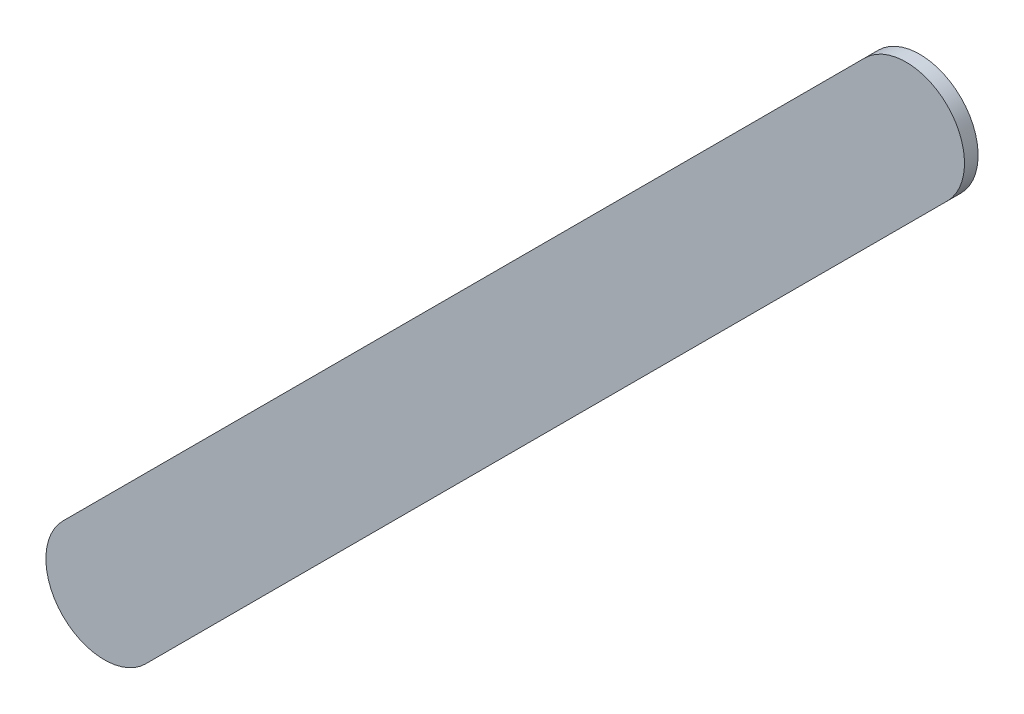
ISO-10303-21;
HEADER;
FILE_DESCRIPTION(('STEP AP214'),'2;1');
FILE_NAME('part.step','',(''),(''),'','','');
FILE_SCHEMA(('AUTOMOTIVE_DESIGN { 1 0 10303 214 1 1 1 1 }'));
ENDSEC;
DATA;
#1=APPLICATION_CONTEXT('core data for automotive mechanical design processes');
#2=APPLICATION_PROTOCOL_DEFINITION('international standard','automotive_design',2000,#1);
#3=PRODUCT_CONTEXT('',#1,'mechanical');
#4=PRODUCT('Part','Part','',(#3));
#5=PRODUCT_RELATED_PRODUCT_CATEGORY('part','',(#4));
#6=PRODUCT_DEFINITION_FORMATION('','',#4);
#7=PRODUCT_DEFINITION_CONTEXT('part definition',#1,'design');
#8=PRODUCT_DEFINITION('design','',#6,#7);
#9=PRODUCT_DEFINITION_SHAPE('','',#8);
#10=(LENGTH_UNIT() NAMED_UNIT(*) SI_UNIT(.MILLI.,.METRE.));
#11=(NAMED_UNIT(*) PLANE_ANGLE_UNIT() SI_UNIT($,.RADIAN.));
#12=(NAMED_UNIT(*) SI_UNIT($,.STERADIAN.) SOLID_ANGLE_UNIT());
#13=UNCERTAINTY_MEASURE_WITH_UNIT(LENGTH_MEASURE(1.E-05),#10,'distance_accuracy_value','');
#14=(GEOMETRIC_REPRESENTATION_CONTEXT(3) GLOBAL_UNCERTAINTY_ASSIGNED_CONTEXT((#13)) GLOBAL_UNIT_ASSIGNED_CONTEXT((#10,
#11,#12)) REPRESENTATION_CONTEXT('',''));
#15=CARTESIAN_POINT('',(0.,0.,0.));
#16=DIRECTION('',(0.,0.,1.));
#17=DIRECTION('',(1.,0.,0.));
#18=AXIS2_PLACEMENT_3D('',#15,#16,#17);
#19=CARTESIAN_POINT('',(77.543933,-90.643933,1.635));
#20=DIRECTION('',(0.,0.,1.));
#21=DIRECTION('',(1.,0.,0.));
#22=AXIS2_PLACEMENT_3D('',#19,#20,#21);
#23=PLANE('',#22);
#24=DIRECTION('',(-0.707106781186548,-0.707106781186548,0.));
#25=VECTOR('',#24,1.);
#26=CARTESIAN_POINT('',(77.543933,-90.643933,1.635));
#27=LINE('',#26,#25);
#28=CARTESIAN_POINT('',(77.543933,-90.643933,1.635));
#29=VERTEX_POINT('',#28);
#30=CARTESIAN_POINT('',(75.483933,-92.703933,1.635));
#31=VERTEX_POINT('',#30);
#32=EDGE_CURVE('E90',#29,#31,#27,.T.);
#33=ORIENTED_EDGE('',*,*,#32,.T.);
#34=CARTESIAN_POINT('',(75.5899995,-92.8099995,1.635));
#35=DIRECTION('',(0.,0.,1.));
#36=DIRECTION('',(-0.707106781186548,0.707106781186548,0.));
#37=AXIS2_PLACEMENT_3D('',#34,#35,#36);
#38=CIRCLE('',#37,0.150000682813);
#39=CARTESIAN_POINT('',(75.696066,-92.916066,1.635));
#40=VERTEX_POINT('',#39);
#41=EDGE_CURVE('E68',#31,#40,#38,.T.);
#42=ORIENTED_EDGE('',*,*,#41,.T.);
#43=DIRECTION('',(0.707106781186548,0.707106781186548,0.));
#44=VECTOR('',#43,1.);
#45=CARTESIAN_POINT('',(75.696066,-92.916066,1.635));
#46=LINE('',#45,#44);
#47=CARTESIAN_POINT('',(77.756066,-90.856066,1.635));
#48=VERTEX_POINT('',#47);
#49=EDGE_CURVE('E84',#40,#48,#46,.T.);
#50=ORIENTED_EDGE('',*,*,#49,.T.);
#51=CARTESIAN_POINT('',(77.6499995,-90.7499995,1.635));
#52=DIRECTION('',(0.,0.,1.));
#53=DIRECTION('',(0.707106781186548,-0.707106781186548,0.));
#54=AXIS2_PLACEMENT_3D('',#51,#52,#53);
#55=CIRCLE('',#54,0.150000682813);
#56=EDGE_CURVE('E11',#48,#29,#55,.T.);
#57=ORIENTED_EDGE('',*,*,#56,.T.);
#58=EDGE_LOOP('',(#33,#42,#50,#57));
#59=FACE_BOUND('',#58,.T.);
#60=ADVANCED_FACE('F17',(#59),#23,.T.);
#61=CARTESIAN_POINT('',(77.543933,-90.643933,1.6));
#62=DIRECTION('',(0.,0.,1.));
#63=DIRECTION('',(1.,0.,0.));
#64=AXIS2_PLACEMENT_3D('',#61,#62,#63);
#65=PLANE('',#64);
#66=CARTESIAN_POINT('',(77.6499995,-90.7499995,1.6));
#67=DIRECTION('',(0.,0.,1.));
#68=DIRECTION('',(0.707106781186548,-0.707106781186548,0.));
#69=AXIS2_PLACEMENT_3D('',#66,#67,#68);
#70=CIRCLE('',#69,0.150000682813);
#71=CARTESIAN_POINT('',(77.756066,-90.856066,1.6));
#72=VERTEX_POINT('',#71);
#73=CARTESIAN_POINT('',(77.543933,-90.643933,1.6));
#74=VERTEX_POINT('',#73);
#75=EDGE_CURVE('E26',#72,#74,#70,.T.);
#76=ORIENTED_EDGE('',*,*,#75,.F.);
#77=DIRECTION('',(0.707106781186548,0.707106781186548,0.));
#78=VECTOR('',#77,1.);
#79=CARTESIAN_POINT('',(75.696066,-92.916066,1.6));
#80=LINE('',#79,#78);
#81=CARTESIAN_POINT('',(75.696066,-92.916066,1.6));
#82=VERTEX_POINT('',#81);
#83=EDGE_CURVE('E50',#82,#72,#80,.T.);
#84=ORIENTED_EDGE('',*,*,#83,.F.);
#85=CARTESIAN_POINT('',(75.5899995,-92.8099995,1.6));
#86=DIRECTION('',(0.,0.,1.));
#87=DIRECTION('',(-0.707106781186548,0.707106781186548,0.));
#88=AXIS2_PLACEMENT_3D('',#85,#86,#87);
#89=CIRCLE('',#88,0.150000682813);
#90=CARTESIAN_POINT('',(75.483933,-92.703933,1.6));
#91=VERTEX_POINT('',#90);
#92=EDGE_CURVE('E92',#91,#82,#89,.T.);
#93=ORIENTED_EDGE('',*,*,#92,.F.);
#94=DIRECTION('',(-0.707106781186548,-0.707106781186548,0.));
#95=VECTOR('',#94,1.);
#96=CARTESIAN_POINT('',(77.543933,-90.643933,1.6));
#97=LINE('',#96,#95);
#98=EDGE_CURVE('E89',#74,#91,#97,.T.);
#99=ORIENTED_EDGE('',*,*,#98,.F.);
#100=EDGE_LOOP('',(#76,#84,#93,#99));
#101=FACE_BOUND('',#100,.T.);
#102=ADVANCED_FACE('F94',(#101),#65,.F.);
#103=CARTESIAN_POINT('',(77.6499995,-90.7499995,1.6));
#104=DIRECTION('',(0.,0.,-1.));
#105=DIRECTION('',(0.707106781186548,-0.707106781186548,0.));
#106=AXIS2_PLACEMENT_3D('',#103,#104,#105);
#107=CYLINDRICAL_SURFACE('',#106,0.150000682813);
#108=ORIENTED_EDGE('',*,*,#75,.T.);
#109=DIRECTION('',(0.,0.,1.));
#110=VECTOR('',#109,1.);
#111=CARTESIAN_POINT('',(77.543933,-90.643933,1.6));
#112=LINE('',#111,#110);
#113=EDGE_CURVE('E78',#74,#29,#112,.T.);
#114=ORIENTED_EDGE('',*,*,#113,.T.);
#115=ORIENTED_EDGE('',*,*,#56,.F.);
#116=DIRECTION('',(0.,0.,1.));
#117=VECTOR('',#116,1.);
#118=CARTESIAN_POINT('',(77.756066,-90.856066,1.6));
#119=LINE('',#118,#117);
#120=EDGE_CURVE('E81',#72,#48,#119,.T.);
#121=ORIENTED_EDGE('',*,*,#120,.F.);
#122=EDGE_LOOP('',(#108,#114,#115,#121));
#123=FACE_BOUND('',#122,.T.);
#124=ADVANCED_FACE('F77',(#123),#107,.T.);
#125=CARTESIAN_POINT('',(75.696066,-92.916066,1.6));
#126=DIRECTION('',(-0.707106781186548,0.707106781186548,0.));
#127=DIRECTION('',(0.,0.,1.));
#128=AXIS2_PLACEMENT_3D('',#125,#126,#127);
#129=PLANE('',#128);
#130=ORIENTED_EDGE('',*,*,#83,.T.);
#131=ORIENTED_EDGE('',*,*,#120,.T.);
#132=ORIENTED_EDGE('',*,*,#49,.F.);
#133=DIRECTION('',(0.,0.,1.));
#134=VECTOR('',#133,1.);
#135=CARTESIAN_POINT('',(75.696066,-92.916066,1.6));
#136=LINE('',#135,#134);
#137=EDGE_CURVE('E113',#82,#40,#136,.T.);
#138=ORIENTED_EDGE('',*,*,#137,.F.);
#139=EDGE_LOOP('',(#130,#131,#132,#138));
#140=FACE_BOUND('',#139,.T.);
#141=ADVANCED_FACE('F122',(#140),#129,.F.);
#142=CARTESIAN_POINT('',(75.5899995,-92.8099995,1.6));
#143=DIRECTION('',(0.,0.,-1.));
#144=DIRECTION('',(-0.707106781186548,0.707106781186548,0.));
#145=AXIS2_PLACEMENT_3D('',#142,#143,#144);
#146=CYLINDRICAL_SURFACE('',#145,0.150000682813);
#147=ORIENTED_EDGE('',*,*,#92,.T.);
#148=ORIENTED_EDGE('',*,*,#137,.T.);
#149=ORIENTED_EDGE('',*,*,#41,.F.);
#150=DIRECTION('',(0.,0.,1.));
#151=VECTOR('',#150,1.);
#152=CARTESIAN_POINT('',(75.483933,-92.703933,1.6));
#153=LINE('',#152,#151);
#154=EDGE_CURVE('E97',#91,#31,#153,.T.);
#155=ORIENTED_EDGE('',*,*,#154,.F.);
#156=EDGE_LOOP('',(#147,#148,#149,#155));
#157=FACE_BOUND('',#156,.T.);
#158=ADVANCED_FACE('F123',(#157),#146,.T.);
#159=CARTESIAN_POINT('',(77.543933,-90.643933,1.6));
#160=DIRECTION('',(0.707106781186548,-0.707106781186548,0.));
#161=DIRECTION('',(0.,0.,-1.));
#162=AXIS2_PLACEMENT_3D('',#159,#160,#161);
#163=PLANE('',#162);
#164=ORIENTED_EDGE('',*,*,#98,.T.);
#165=ORIENTED_EDGE('',*,*,#154,.T.);
#166=ORIENTED_EDGE('',*,*,#32,.F.);
#167=ORIENTED_EDGE('',*,*,#113,.F.);
#168=EDGE_LOOP('',(#164,#165,#166,#167));
#169=FACE_BOUND('',#168,.T.);
#170=ADVANCED_FACE('F87',(#169),#163,.F.);
#171=CLOSED_SHELL('',(#60,#102,#124,#141,#158,#170));
#172=MANIFOLD_SOLID_BREP('B1',#171);
#173=ADVANCED_BREP_SHAPE_REPRESENTATION('',(#18,#172),#14);
#174=SHAPE_DEFINITION_REPRESENTATION(#9,#173);
ENDSEC;
END-ISO-10303-21;
